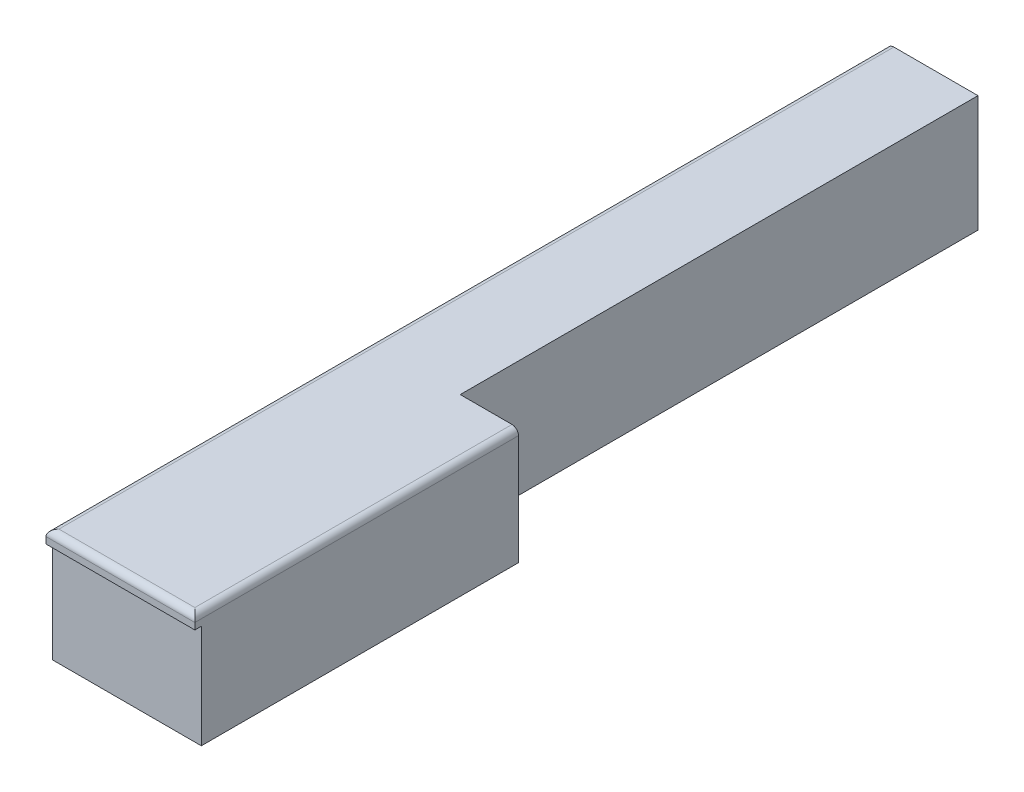
ISO-10303-21;
HEADER;
FILE_DESCRIPTION(('STEP AP214'),'2;1');
FILE_NAME('part.step','',(''),(''),'','','');
FILE_SCHEMA(('AUTOMOTIVE_DESIGN { 1 0 10303 214 1 1 1 1 }'));
ENDSEC;
DATA;
#1=APPLICATION_CONTEXT('core data for automotive mechanical design processes');
#2=APPLICATION_PROTOCOL_DEFINITION('international standard','automotive_design',2000,#1);
#3=PRODUCT_CONTEXT('',#1,'mechanical');
#4=PRODUCT('Part','Part','',(#3));
#5=PRODUCT_RELATED_PRODUCT_CATEGORY('part','',(#4));
#6=PRODUCT_DEFINITION_FORMATION('','',#4);
#7=PRODUCT_DEFINITION_CONTEXT('part definition',#1,'design');
#8=PRODUCT_DEFINITION('design','',#6,#7);
#9=PRODUCT_DEFINITION_SHAPE('','',#8);
#10=(LENGTH_UNIT() NAMED_UNIT(*) SI_UNIT(.MILLI.,.METRE.));
#11=(NAMED_UNIT(*) PLANE_ANGLE_UNIT() SI_UNIT($,.RADIAN.));
#12=(NAMED_UNIT(*) SI_UNIT($,.STERADIAN.) SOLID_ANGLE_UNIT());
#13=UNCERTAINTY_MEASURE_WITH_UNIT(LENGTH_MEASURE(1.E-05),#10,'distance_accuracy_value','');
#14=(GEOMETRIC_REPRESENTATION_CONTEXT(3) GLOBAL_UNCERTAINTY_ASSIGNED_CONTEXT((#13)) GLOBAL_UNIT_ASSIGNED_CONTEXT((#10,
#11,#12)) REPRESENTATION_CONTEXT('',''));
#15=CARTESIAN_POINT('',(0.,0.,0.));
#16=DIRECTION('',(0.,0.,1.));
#17=DIRECTION('',(1.,0.,0.));
#18=AXIS2_PLACEMENT_3D('',#15,#16,#17);
#19=CARTESIAN_POINT('',(14.,18.,0.));
#20=DIRECTION('',(1.,0.,0.));
#21=DIRECTION('',(0.,0.,-1.));
#22=AXIS2_PLACEMENT_3D('',#19,#20,#21);
#23=PLANE('',#22);
#24=DIRECTION('',(0.,0.,1.));
#25=VECTOR('',#24,1.);
#26=CARTESIAN_POINT('',(14.,0.,0.));
#27=LINE('',#26,#25);
#28=CARTESIAN_POINT('',(14.,0.,-130.));
#29=VERTEX_POINT('',#28);
#30=CARTESIAN_POINT('',(14.,0.,-50.));
#31=VERTEX_POINT('',#30);
#32=EDGE_CURVE('E193',#29,#31,#27,.T.);
#33=ORIENTED_EDGE('',*,*,#32,.F.);
#34=DIRECTION('',(0.,-1.,0.));
#35=VECTOR('',#34,1.);
#36=CARTESIAN_POINT('',(14.,18.,-130.));
#37=LINE('',#36,#35);
#38=CARTESIAN_POINT('',(14.,18.,-130.));
#39=VERTEX_POINT('',#38);
#40=EDGE_CURVE('E157',#39,#29,#37,.T.);
#41=ORIENTED_EDGE('',*,*,#40,.F.);
#42=DIRECTION('',(0.,0.,1.));
#43=VECTOR('',#42,1.);
#44=CARTESIAN_POINT('',(14.,18.,0.));
#45=LINE('',#44,#43);
#46=CARTESIAN_POINT('',(14.,18.,-50.));
#47=VERTEX_POINT('',#46);
#48=EDGE_CURVE('E140',#39,#47,#45,.T.);
#49=ORIENTED_EDGE('',*,*,#48,.T.);
#50=DIRECTION('',(0.,-1.,0.));
#51=VECTOR('',#50,1.);
#52=CARTESIAN_POINT('',(14.,18.,-50.));
#53=LINE('',#52,#51);
#54=EDGE_CURVE('E146',#47,#31,#53,.T.);
#55=ORIENTED_EDGE('',*,*,#54,.T.);
#56=EDGE_LOOP('',(#33,#41,#49,#55));
#57=FACE_BOUND('',#56,.T.);
#58=ADVANCED_FACE('F35',(#57),#23,.T.);
#59=CARTESIAN_POINT('',(0.,18.,-130.));
#60=DIRECTION('',(0.,0.,-1.));
#61=DIRECTION('',(-1.,0.,0.));
#62=AXIS2_PLACEMENT_3D('',#59,#60,#61);
#63=PLANE('',#62);
#64=DIRECTION('',(0.,-1.,0.));
#65=VECTOR('',#64,1.);
#66=CARTESIAN_POINT('',(0.,18.,-130.));
#67=LINE('',#66,#65);
#68=CARTESIAN_POINT('',(0.,17.,-130.));
#69=VERTEX_POINT('',#68);
#70=CARTESIAN_POINT('',(0.,0.,-130.));
#71=VERTEX_POINT('',#70);
#72=EDGE_CURVE('E155',#69,#71,#67,.T.);
#73=ORIENTED_EDGE('',*,*,#72,.F.);
#74=CARTESIAN_POINT('',(0.999999999999976,17.,-130.));
#75=DIRECTION('',(0.,0.,-1.));
#76=DIRECTION('',(-1.,0.,0.));
#77=AXIS2_PLACEMENT_3D('',#74,#75,#76);
#78=CIRCLE('',#77,1.);
#79=CARTESIAN_POINT('',(0.999999999999976,18.,-130.));
#80=VERTEX_POINT('',#79);
#81=EDGE_CURVE('E162',#69,#80,#78,.T.);
#82=ORIENTED_EDGE('',*,*,#81,.T.);
#83=DIRECTION('',(1.,0.,0.));
#84=VECTOR('',#83,1.);
#85=CARTESIAN_POINT('',(0.,18.,-130.));
#86=LINE('',#85,#84);
#87=EDGE_CURVE('E197',#80,#39,#86,.T.);
#88=ORIENTED_EDGE('',*,*,#87,.T.);
#89=ORIENTED_EDGE('',*,*,#40,.T.);
#90=DIRECTION('',(1.,0.,0.));
#91=VECTOR('',#90,1.);
#92=CARTESIAN_POINT('',(0.,0.,-130.));
#93=LINE('',#92,#91);
#94=EDGE_CURVE('E142',#71,#29,#93,.T.);
#95=ORIENTED_EDGE('',*,*,#94,.F.);
#96=EDGE_LOOP('',(#73,#82,#88,#89,#95));
#97=FACE_BOUND('',#96,.T.);
#98=ADVANCED_FACE('F205',(#97),#63,.T.);
#99=CARTESIAN_POINT('',(0.,18.,0.));
#100=DIRECTION('',(-1.,0.,0.));
#101=DIRECTION('',(0.,0.,1.));
#102=AXIS2_PLACEMENT_3D('',#99,#100,#101);
#103=PLANE('',#102);
#104=DIRECTION('',(0.,-1.,0.));
#105=VECTOR('',#104,1.);
#106=CARTESIAN_POINT('',(0.,18.,0.));
#107=LINE('',#106,#105);
#108=CARTESIAN_POINT('',(0.,17.,0.));
#109=VERTEX_POINT('',#108);
#110=CARTESIAN_POINT('',(0.,16.,0.));
#111=VERTEX_POINT('',#110);
#112=EDGE_CURVE('E153',#109,#111,#107,.T.);
#113=ORIENTED_EDGE('',*,*,#112,.F.);
#114=DIRECTION('',(0.,0.,-1.));
#115=VECTOR('',#114,1.);
#116=CARTESIAN_POINT('',(0.,17.,0.));
#117=LINE('',#116,#115);
#118=EDGE_CURVE('E159',#109,#69,#117,.T.);
#119=ORIENTED_EDGE('',*,*,#118,.T.);
#120=ORIENTED_EDGE('',*,*,#72,.T.);
#121=DIRECTION('',(0.,0.,-1.));
#122=VECTOR('',#121,1.);
#123=CARTESIAN_POINT('',(0.,0.,0.));
#124=LINE('',#123,#122);
#125=CARTESIAN_POINT('',(0.,0.,-1.));
#126=VERTEX_POINT('',#125);
#127=EDGE_CURVE('E138',#126,#71,#124,.T.);
#128=ORIENTED_EDGE('',*,*,#127,.F.);
#129=DIRECTION('',(0.,-1.,0.));
#130=VECTOR('',#129,1.);
#131=CARTESIAN_POINT('',(0.,0.,-1.));
#132=LINE('',#131,#130);
#133=CARTESIAN_POINT('',(0.,16.,-1.));
#134=VERTEX_POINT('',#133);
#135=EDGE_CURVE('E119',#134,#126,#132,.T.);
#136=ORIENTED_EDGE('',*,*,#135,.F.);
#137=DIRECTION('',(0.,0.,1.));
#138=VECTOR('',#137,1.);
#139=CARTESIAN_POINT('',(0.,16.,-1.));
#140=LINE('',#139,#138);
#141=EDGE_CURVE('E191',#134,#111,#140,.T.);
#142=ORIENTED_EDGE('',*,*,#141,.T.);
#143=EDGE_LOOP('',(#113,#119,#120,#128,#136,#142));
#144=FACE_BOUND('',#143,.T.);
#145=ADVANCED_FACE('F219',(#144),#103,.T.);
#146=CARTESIAN_POINT('',(0.,18.,0.));
#147=DIRECTION('',(0.,0.,-1.));
#148=DIRECTION('',(-1.,0.,0.));
#149=AXIS2_PLACEMENT_3D('',#146,#147,#148);
#150=PLANE('',#149);
#151=DIRECTION('',(0.,-1.,0.));
#152=VECTOR('',#151,1.);
#153=CARTESIAN_POINT('',(23.,18.,0.));
#154=LINE('',#153,#152);
#155=CARTESIAN_POINT('',(23.,17.,0.));
#156=VERTEX_POINT('',#155);
#157=CARTESIAN_POINT('',(23.,16.,0.));
#158=VERTEX_POINT('',#157);
#159=EDGE_CURVE('E151',#156,#158,#154,.T.);
#160=ORIENTED_EDGE('',*,*,#159,.F.);
#161=DIRECTION('',(1.,0.,0.));
#162=VECTOR('',#161,1.);
#163=CARTESIAN_POINT('',(0.,17.,0.));
#164=LINE('',#163,#162);
#165=EDGE_CURVE('E11',#156,#109,#164,.F.);
#166=ORIENTED_EDGE('',*,*,#165,.T.);
#167=ORIENTED_EDGE('',*,*,#112,.T.);
#168=DIRECTION('',(-1.,0.,0.));
#169=VECTOR('',#168,1.);
#170=CARTESIAN_POINT('',(0.,16.,0.));
#171=LINE('',#170,#169);
#172=EDGE_CURVE('E178',#158,#111,#171,.T.);
#173=ORIENTED_EDGE('',*,*,#172,.F.);
#174=EDGE_LOOP('',(#160,#166,#167,#173));
#175=FACE_BOUND('',#174,.T.);
#176=ADVANCED_FACE('F217',(#175),#150,.F.);
#177=CARTESIAN_POINT('',(23.,18.,0.));
#178=DIRECTION('',(-1.,0.,0.));
#179=DIRECTION('',(0.,0.,1.));
#180=AXIS2_PLACEMENT_3D('',#177,#178,#179);
#181=PLANE('',#180);
#182=DIRECTION('',(0.,-1.,0.));
#183=VECTOR('',#182,1.);
#184=CARTESIAN_POINT('',(23.,18.,-50.));
#185=LINE('',#184,#183);
#186=CARTESIAN_POINT('',(23.,17.,-50.));
#187=VERTEX_POINT('',#186);
#188=CARTESIAN_POINT('',(23.,0.,-50.));
#189=VERTEX_POINT('',#188);
#190=EDGE_CURVE('E148',#187,#189,#185,.T.);
#191=ORIENTED_EDGE('',*,*,#190,.F.);
#192=DIRECTION('',(0.,0.,-1.));
#193=VECTOR('',#192,1.);
#194=CARTESIAN_POINT('',(23.,17.,0.));
#195=LINE('',#194,#193);
#196=EDGE_CURVE('E44',#187,#156,#195,.F.);
#197=ORIENTED_EDGE('',*,*,#196,.T.);
#198=ORIENTED_EDGE('',*,*,#159,.T.);
#199=DIRECTION('',(0.,0.,1.));
#200=VECTOR('',#199,1.);
#201=CARTESIAN_POINT('',(23.,16.,-1.));
#202=LINE('',#201,#200);
#203=CARTESIAN_POINT('',(23.,16.,-1.));
#204=VERTEX_POINT('',#203);
#205=EDGE_CURVE('E131',#204,#158,#202,.T.);
#206=ORIENTED_EDGE('',*,*,#205,.F.);
#207=DIRECTION('',(0.,1.,0.));
#208=VECTOR('',#207,1.);
#209=CARTESIAN_POINT('',(23.,0.,-1.));
#210=LINE('',#209,#208);
#211=CARTESIAN_POINT('',(23.,0.,-1.));
#212=VERTEX_POINT('',#211);
#213=EDGE_CURVE('E116',#212,#204,#210,.T.);
#214=ORIENTED_EDGE('',*,*,#213,.F.);
#215=DIRECTION('',(0.,0.,-1.));
#216=VECTOR('',#215,1.);
#217=CARTESIAN_POINT('',(23.,0.,0.));
#218=LINE('',#217,#216);
#219=EDGE_CURVE('E128',#212,#189,#218,.T.);
#220=ORIENTED_EDGE('',*,*,#219,.T.);
#221=EDGE_LOOP('',(#191,#197,#198,#206,#214,#220));
#222=FACE_BOUND('',#221,.T.);
#223=ADVANCED_FACE('F127',(#222),#181,.F.);
#224=CARTESIAN_POINT('',(0.,18.,-50.));
#225=DIRECTION('',(0.,0.,1.));
#226=DIRECTION('',(1.,0.,0.));
#227=AXIS2_PLACEMENT_3D('',#224,#225,#226);
#228=PLANE('',#227);
#229=DIRECTION('',(-1.,0.,0.));
#230=VECTOR('',#229,1.);
#231=CARTESIAN_POINT('',(0.,18.,-50.));
#232=LINE('',#231,#230);
#233=CARTESIAN_POINT('',(22.,18.,-50.));
#234=VERTEX_POINT('',#233);
#235=EDGE_CURVE('E149',#234,#47,#232,.T.);
#236=ORIENTED_EDGE('',*,*,#235,.F.);
#237=CARTESIAN_POINT('',(22.,17.,-50.));
#238=DIRECTION('',(0.,0.,1.));
#239=DIRECTION('',(1.,0.,0.));
#240=AXIS2_PLACEMENT_3D('',#237,#238,#239);
#241=CIRCLE('',#240,1.);
#242=EDGE_CURVE('E59',#234,#187,#241,.F.);
#243=ORIENTED_EDGE('',*,*,#242,.T.);
#244=ORIENTED_EDGE('',*,*,#190,.T.);
#245=DIRECTION('',(-1.,0.,0.));
#246=VECTOR('',#245,1.);
#247=CARTESIAN_POINT('',(0.,0.,-50.));
#248=LINE('',#247,#246);
#249=EDGE_CURVE('E137',#189,#31,#248,.T.);
#250=ORIENTED_EDGE('',*,*,#249,.T.);
#251=ORIENTED_EDGE('',*,*,#54,.F.);
#252=EDGE_LOOP('',(#236,#243,#244,#250,#251));
#253=FACE_BOUND('',#252,.T.);
#254=ADVANCED_FACE('F211',(#253),#228,.F.);
#255=CARTESIAN_POINT('',(0.,18.,0.));
#256=DIRECTION('',(0.,1.,0.));
#257=DIRECTION('',(0.,0.,1.));
#258=AXIS2_PLACEMENT_3D('',#255,#256,#257);
#259=PLANE('',#258);
#260=ORIENTED_EDGE('',*,*,#87,.F.);
#261=DIRECTION('',(0.,0.,-1.));
#262=VECTOR('',#261,1.);
#263=CARTESIAN_POINT('',(1.,18.,0.));
#264=LINE('',#263,#262);
#265=CARTESIAN_POINT('',(1.,18.,-1.));
#266=VERTEX_POINT('',#265);
#267=EDGE_CURVE('E168',#80,#266,#264,.F.);
#268=ORIENTED_EDGE('',*,*,#267,.T.);
#269=DIRECTION('',(1.,0.,0.));
#270=VECTOR('',#269,1.);
#271=CARTESIAN_POINT('',(23.,18.,-1.));
#272=LINE('',#271,#270);
#273=CARTESIAN_POINT('',(22.,18.,-1.));
#274=VERTEX_POINT('',#273);
#275=EDGE_CURVE('E164',#266,#274,#272,.T.);
#276=ORIENTED_EDGE('',*,*,#275,.T.);
#277=DIRECTION('',(0.,0.,-1.));
#278=VECTOR('',#277,1.);
#279=CARTESIAN_POINT('',(22.,18.,-50.));
#280=LINE('',#279,#278);
#281=EDGE_CURVE('E166',#274,#234,#280,.T.);
#282=ORIENTED_EDGE('',*,*,#281,.T.);
#283=ORIENTED_EDGE('',*,*,#235,.T.);
#284=ORIENTED_EDGE('',*,*,#48,.F.);
#285=EDGE_LOOP('',(#260,#268,#276,#282,#283,#284));
#286=FACE_BOUND('',#285,.T.);
#287=ADVANCED_FACE('F228',(#286),#259,.T.);
#288=CARTESIAN_POINT('',(0.,0.,0.));
#289=DIRECTION('',(0.,1.,0.));
#290=DIRECTION('',(0.,0.,1.));
#291=AXIS2_PLACEMENT_3D('',#288,#289,#290);
#292=PLANE('',#291);
#293=ORIENTED_EDGE('',*,*,#219,.F.);
#294=DIRECTION('',(1.,0.,0.));
#295=VECTOR('',#294,1.);
#296=CARTESIAN_POINT('',(0.,0.,-1.));
#297=LINE('',#296,#295);
#298=EDGE_CURVE('E112',#126,#212,#297,.T.);
#299=ORIENTED_EDGE('',*,*,#298,.F.);
#300=ORIENTED_EDGE('',*,*,#127,.T.);
#301=ORIENTED_EDGE('',*,*,#94,.T.);
#302=ORIENTED_EDGE('',*,*,#32,.T.);
#303=ORIENTED_EDGE('',*,*,#249,.F.);
#304=EDGE_LOOP('',(#293,#299,#300,#301,#302,#303));
#305=FACE_BOUND('',#304,.T.);
#306=ADVANCED_FACE('F134',(#305),#292,.F.);
#307=CARTESIAN_POINT('',(0.,16.,-1.));
#308=DIRECTION('',(0.,1.,0.));
#309=DIRECTION('',(0.,0.,1.));
#310=AXIS2_PLACEMENT_3D('',#307,#308,#309);
#311=PLANE('',#310);
#312=ORIENTED_EDGE('',*,*,#172,.T.);
#313=ORIENTED_EDGE('',*,*,#141,.F.);
#314=DIRECTION('',(-1.,0.,0.));
#315=VECTOR('',#314,1.);
#316=CARTESIAN_POINT('',(0.,16.,-1.));
#317=LINE('',#316,#315);
#318=EDGE_CURVE('E132',#204,#134,#317,.T.);
#319=ORIENTED_EDGE('',*,*,#318,.F.);
#320=ORIENTED_EDGE('',*,*,#205,.T.);
#321=EDGE_LOOP('',(#312,#313,#319,#320));
#322=FACE_BOUND('',#321,.T.);
#323=ADVANCED_FACE('F220',(#322),#311,.F.);
#324=CARTESIAN_POINT('',(0.,0.,-1.));
#325=DIRECTION('',(0.,0.,-1.));
#326=DIRECTION('',(-1.,0.,0.));
#327=AXIS2_PLACEMENT_3D('',#324,#325,#326);
#328=PLANE('',#327);
#329=ORIENTED_EDGE('',*,*,#135,.T.);
#330=ORIENTED_EDGE('',*,*,#298,.T.);
#331=ORIENTED_EDGE('',*,*,#213,.T.);
#332=ORIENTED_EDGE('',*,*,#318,.T.);
#333=EDGE_LOOP('',(#329,#330,#331,#332));
#334=FACE_BOUND('',#333,.T.);
#335=ADVANCED_FACE('F114',(#334),#328,.F.);
#336=CARTESIAN_POINT('',(22.,17.,0.));
#337=DIRECTION('',(0.,0.,1.));
#338=DIRECTION('',(1.,0.,0.));
#339=AXIS2_PLACEMENT_3D('',#336,#337,#338);
#340=CYLINDRICAL_SURFACE('',#339,1.);
#341=ORIENTED_EDGE('',*,*,#242,.F.);
#342=ORIENTED_EDGE('',*,*,#281,.F.);
#343=CARTESIAN_POINT('',(22.,17.,-1.));
#344=DIRECTION('',(-0.707106781186547,0.,0.707106781186548));
#345=DIRECTION('',(-0.707106781186548,0.,-0.707106781186547));
#346=AXIS2_PLACEMENT_3D('',#343,#344,#345);
#347=ELLIPSE('',#346,1.4142135623731,1.);
#348=EDGE_CURVE('E39',#156,#274,#347,.T.);
#349=ORIENTED_EDGE('',*,*,#348,.F.);
#350=ORIENTED_EDGE('',*,*,#196,.F.);
#351=EDGE_LOOP('',(#341,#342,#349,#350));
#352=FACE_BOUND('',#351,.T.);
#353=ADVANCED_FACE('F37',(#352),#340,.T.);
#354=CARTESIAN_POINT('',(0.,17.,-1.));
#355=DIRECTION('',(-1.,0.,0.));
#356=DIRECTION('',(0.,0.,1.));
#357=AXIS2_PLACEMENT_3D('',#354,#355,#356);
#358=CYLINDRICAL_SURFACE('',#357,1.);
#359=ORIENTED_EDGE('',*,*,#348,.T.);
#360=ORIENTED_EDGE('',*,*,#275,.F.);
#361=CARTESIAN_POINT('',(1.,17.,-1.));
#362=DIRECTION('',(-0.707106781186548,0.,-0.707106781186547));
#363=DIRECTION('',(-0.707106781186547,0.,0.707106781186548));
#364=AXIS2_PLACEMENT_3D('',#361,#362,#363);
#365=ELLIPSE('',#364,1.41421356237309,1.);
#366=EDGE_CURVE('E171',#109,#266,#365,.T.);
#367=ORIENTED_EDGE('',*,*,#366,.F.);
#368=ORIENTED_EDGE('',*,*,#165,.F.);
#369=EDGE_LOOP('',(#359,#360,#367,#368));
#370=FACE_BOUND('',#369,.T.);
#371=ADVANCED_FACE('F214',(#370),#358,.T.);
#372=CARTESIAN_POINT('',(1.,17.,0.));
#373=DIRECTION('',(0.,0.,-1.));
#374=DIRECTION('',(-1.,0.,0.));
#375=AXIS2_PLACEMENT_3D('',#372,#373,#374);
#376=CYLINDRICAL_SURFACE('',#375,1.);
#377=ORIENTED_EDGE('',*,*,#366,.T.);
#378=ORIENTED_EDGE('',*,*,#267,.F.);
#379=ORIENTED_EDGE('',*,*,#81,.F.);
#380=ORIENTED_EDGE('',*,*,#118,.F.);
#381=EDGE_LOOP('',(#377,#378,#379,#380));
#382=FACE_BOUND('',#381,.T.);
#383=ADVANCED_FACE('F239',(#382),#376,.T.);
#384=CLOSED_SHELL('',(#58,#98,#145,#176,#223,#254,#287,#306,#323,#335,#353,#371,#383));
#385=MANIFOLD_SOLID_BREP('B2',#384);
#386=ADVANCED_BREP_SHAPE_REPRESENTATION('',(#18,#385),#14);
#387=SHAPE_DEFINITION_REPRESENTATION(#9,#386);
ENDSEC;
END-ISO-10303-21;
